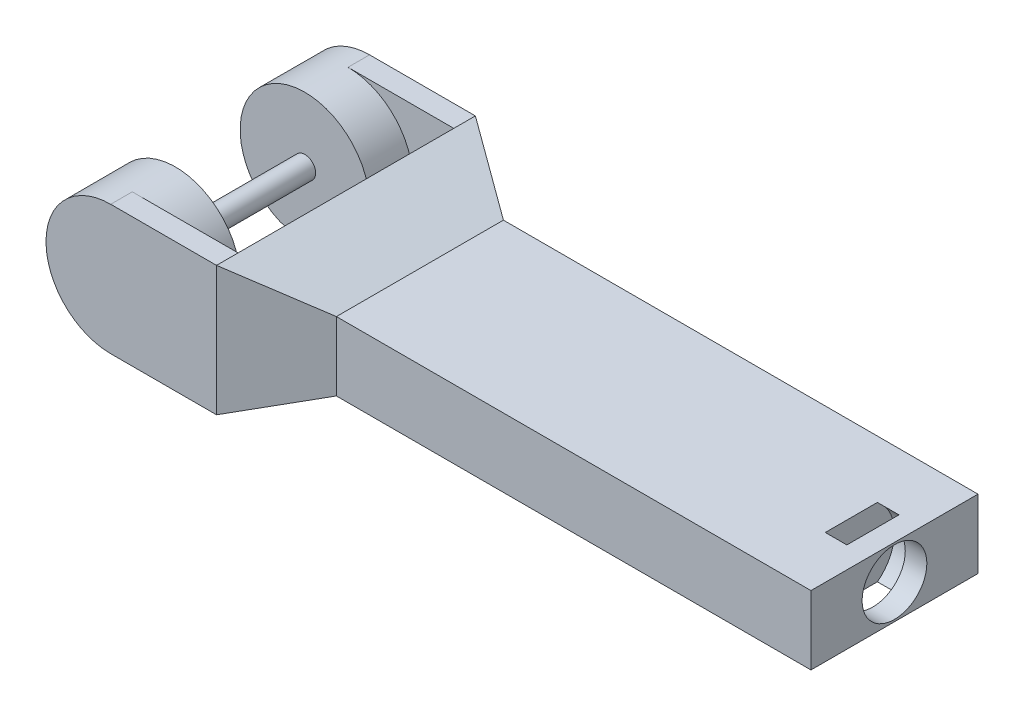
ISO-10303-21;
HEADER;
FILE_DESCRIPTION(('STEP AP214'),'2;1');
FILE_NAME('part.step','',(''),(''),'','','');
FILE_SCHEMA(('AUTOMOTIVE_DESIGN { 1 0 10303 214 1 1 1 1 }'));
ENDSEC;
DATA;
#1=APPLICATION_CONTEXT('core data for automotive mechanical design processes');
#2=APPLICATION_PROTOCOL_DEFINITION('international standard','automotive_design',2000,#1);
#3=PRODUCT_CONTEXT('',#1,'mechanical');
#4=PRODUCT('Part','Part','',(#3));
#5=PRODUCT_RELATED_PRODUCT_CATEGORY('part','',(#4));
#6=PRODUCT_DEFINITION_FORMATION('','',#4);
#7=PRODUCT_DEFINITION_CONTEXT('part definition',#1,'design');
#8=PRODUCT_DEFINITION('design','',#6,#7);
#9=PRODUCT_DEFINITION_SHAPE('','',#8);
#10=(LENGTH_UNIT() NAMED_UNIT(*) SI_UNIT(.MILLI.,.METRE.));
#11=(NAMED_UNIT(*) PLANE_ANGLE_UNIT() SI_UNIT($,.RADIAN.));
#12=(NAMED_UNIT(*) SI_UNIT($,.STERADIAN.) SOLID_ANGLE_UNIT());
#13=UNCERTAINTY_MEASURE_WITH_UNIT(LENGTH_MEASURE(1.E-05),#10,'distance_accuracy_value','');
#14=(GEOMETRIC_REPRESENTATION_CONTEXT(3) GLOBAL_UNCERTAINTY_ASSIGNED_CONTEXT((#13)) GLOBAL_UNIT_ASSIGNED_CONTEXT((#10,
#11,#12)) REPRESENTATION_CONTEXT('',''));
#15=CARTESIAN_POINT('',(0.,0.,0.));
#16=DIRECTION('',(0.,0.,1.));
#17=DIRECTION('',(1.,0.,0.));
#18=AXIS2_PLACEMENT_3D('',#15,#16,#17);
#19=CARTESIAN_POINT('',(303.334576319723,-15.9426631994788,38.7153095858183));
#20=DIRECTION('',(0.,1.,0.));
#21=DIRECTION('',(0.,0.,1.));
#22=AXIS2_PLACEMENT_3D('',#19,#20,#21);
#23=PLANE('',#22);
#24=DIRECTION('',(0.,0.,-1.));
#25=VECTOR('',#24,1.);
#26=CARTESIAN_POINT('',(83.3345763197232,-15.9426631994788,60.));
#27=LINE('',#26,#25);
#28=CARTESIAN_POINT('',(83.3345763197232,-15.9426631994788,38.7153095858183));
#29=VERTEX_POINT('',#28);
#30=CARTESIAN_POINT('',(83.3345763197232,-15.9426631994788,-38.7153095858182));
#31=VERTEX_POINT('',#30);
#32=EDGE_CURVE('E297',#29,#31,#27,.T.);
#33=ORIENTED_EDGE('',*,*,#32,.T.);
#34=DIRECTION('',(-1.,0.,0.));
#35=VECTOR('',#34,1.);
#36=CARTESIAN_POINT('',(303.334576319723,-15.9426631994788,-38.7153095858182));
#37=LINE('',#36,#35);
#38=CARTESIAN_POINT('',(303.334576319723,-15.9426631994788,-38.7153095858182));
#39=VERTEX_POINT('',#38);
#40=EDGE_CURVE('E353',#39,#31,#37,.T.);
#41=ORIENTED_EDGE('',*,*,#40,.F.);
#42=DIRECTION('',(0.,0.,-1.));
#43=VECTOR('',#42,1.);
#44=CARTESIAN_POINT('',(303.334576319723,-15.9426631994788,38.7153095858183));
#45=LINE('',#44,#43);
#46=CARTESIAN_POINT('',(303.334576319723,-15.9426631994788,38.7153095858183));
#47=VERTEX_POINT('',#46);
#48=EDGE_CURVE('E623',#47,#39,#45,.T.);
#49=ORIENTED_EDGE('',*,*,#48,.F.);
#50=DIRECTION('',(-1.,0.,0.));
#51=VECTOR('',#50,1.);
#52=CARTESIAN_POINT('',(303.334576319723,-15.9426631994788,38.7153095858183));
#53=LINE('',#52,#51);
#54=EDGE_CURVE('E630',#47,#29,#53,.T.);
#55=ORIENTED_EDGE('',*,*,#54,.T.);
#56=EDGE_LOOP('',(#33,#41,#49,#55));
#57=FACE_BOUND('',#56,.T.);
#58=DIRECTION('',(0.,0.,-1.));
#59=VECTOR('',#58,1.);
#60=CARTESIAN_POINT('',(283.334576319723,-15.9426631994788,38.7153095858183));
#61=LINE('',#60,#59);
#62=CARTESIAN_POINT('',(283.334576319723,-15.9426631994788,12.0760709714701));
#63=VERTEX_POINT('',#62);
#64=CARTESIAN_POINT('',(283.334576319723,-15.9426631994788,-12.0760709714701));
#65=VERTEX_POINT('',#64);
#66=EDGE_CURVE('E611',#63,#65,#61,.T.);
#67=ORIENTED_EDGE('',*,*,#66,.F.);
#68=DIRECTION('',(1.,0.,0.));
#69=VECTOR('',#68,1.);
#70=CARTESIAN_POINT('',(283.334576319723,-15.9426631994788,12.0760709714701));
#71=LINE('',#70,#69);
#72=CARTESIAN_POINT('',(293.334576319723,-15.9426631994788,12.0760709714701));
#73=VERTEX_POINT('',#72);
#74=EDGE_CURVE('E614',#63,#73,#71,.T.);
#75=ORIENTED_EDGE('',*,*,#74,.T.);
#76=DIRECTION('',(0.,0.,-1.));
#77=VECTOR('',#76,1.);
#78=CARTESIAN_POINT('',(293.334576319723,-15.9426631994788,38.7153095858183));
#79=LINE('',#78,#77);
#80=CARTESIAN_POINT('',(293.334576319723,-15.9426631994788,-12.0760709714701));
#81=VERTEX_POINT('',#80);
#82=EDGE_CURVE('E147',#73,#81,#79,.T.);
#83=ORIENTED_EDGE('',*,*,#82,.T.);
#84=DIRECTION('',(1.,0.,0.));
#85=VECTOR('',#84,1.);
#86=CARTESIAN_POINT('',(283.334576319723,-15.9426631994788,-12.0760709714701));
#87=LINE('',#86,#85);
#88=EDGE_CURVE('E155',#81,#65,#87,.F.);
#89=ORIENTED_EDGE('',*,*,#88,.T.);
#90=EDGE_LOOP('',(#67,#75,#83,#89));
#91=FACE_BOUND('',#90,.T.);
#92=ADVANCED_FACE('F33',(#57,#91),#23,.F.);
#93=CARTESIAN_POINT('',(303.334576319723,15.9426631994788,38.7153095858183));
#94=DIRECTION('',(0.,-1.,0.));
#95=DIRECTION('',(0.,0.,-1.));
#96=AXIS2_PLACEMENT_3D('',#93,#94,#95);
#97=PLANE('',#96);
#98=DIRECTION('',(0.,0.,-1.));
#99=VECTOR('',#98,1.);
#100=CARTESIAN_POINT('',(83.3345763197232,15.9426631994788,60.));
#101=LINE('',#100,#99);
#102=CARTESIAN_POINT('',(83.3345763197232,15.9426631994788,38.7153095858183));
#103=VERTEX_POINT('',#102);
#104=CARTESIAN_POINT('',(83.3345763197232,15.9426631994788,-38.7153095858182));
#105=VERTEX_POINT('',#104);
#106=EDGE_CURVE('E320',#103,#105,#101,.T.);
#107=ORIENTED_EDGE('',*,*,#106,.F.);
#108=DIRECTION('',(-1.,0.,0.));
#109=VECTOR('',#108,1.);
#110=CARTESIAN_POINT('',(303.334576319723,15.9426631994788,38.7153095858183));
#111=LINE('',#110,#109);
#112=CARTESIAN_POINT('',(303.334576319723,15.9426631994788,38.7153095858183));
#113=VERTEX_POINT('',#112);
#114=EDGE_CURVE('E358',#113,#103,#111,.T.);
#115=ORIENTED_EDGE('',*,*,#114,.F.);
#116=DIRECTION('',(0.,0.,1.));
#117=VECTOR('',#116,1.);
#118=CARTESIAN_POINT('',(303.334576319723,15.9426631994788,38.7153095858183));
#119=LINE('',#118,#117);
#120=CARTESIAN_POINT('',(303.334576319723,15.9426631994788,-38.7153095858182));
#121=VERTEX_POINT('',#120);
#122=EDGE_CURVE('E357',#121,#113,#119,.T.);
#123=ORIENTED_EDGE('',*,*,#122,.F.);
#124=DIRECTION('',(-1.,0.,0.));
#125=VECTOR('',#124,1.);
#126=CARTESIAN_POINT('',(303.334576319723,15.9426631994788,-38.7153095858182));
#127=LINE('',#126,#125);
#128=EDGE_CURVE('E350',#121,#105,#127,.T.);
#129=ORIENTED_EDGE('',*,*,#128,.T.);
#130=EDGE_LOOP('',(#107,#115,#123,#129));
#131=FACE_BOUND('',#130,.T.);
#132=DIRECTION('',(0.,0.,1.));
#133=VECTOR('',#132,1.);
#134=CARTESIAN_POINT('',(283.334576319723,15.9426631994788,38.7153095858183));
#135=LINE('',#134,#133);
#136=CARTESIAN_POINT('',(283.334576319723,15.9426631994788,-12.0760709714701));
#137=VERTEX_POINT('',#136);
#138=CARTESIAN_POINT('',(283.334576319723,15.9426631994788,12.0760709714701));
#139=VERTEX_POINT('',#138);
#140=EDGE_CURVE('E11',#137,#139,#135,.T.);
#141=ORIENTED_EDGE('',*,*,#140,.F.);
#142=DIRECTION('',(1.,0.,0.));
#143=VECTOR('',#142,1.);
#144=CARTESIAN_POINT('',(283.334576319723,15.9426631994788,-12.0760709714701));
#145=LINE('',#144,#143);
#146=CARTESIAN_POINT('',(293.334576319723,15.9426631994788,-12.0760709714701));
#147=VERTEX_POINT('',#146);
#148=EDGE_CURVE('E41',#137,#147,#145,.T.);
#149=ORIENTED_EDGE('',*,*,#148,.T.);
#150=DIRECTION('',(0.,0.,1.));
#151=VECTOR('',#150,1.);
#152=CARTESIAN_POINT('',(293.334576319723,15.9426631994788,38.7153095858183));
#153=LINE('',#152,#151);
#154=CARTESIAN_POINT('',(293.334576319723,15.9426631994788,12.0760709714701));
#155=VERTEX_POINT('',#154);
#156=EDGE_CURVE('E142',#147,#155,#153,.T.);
#157=ORIENTED_EDGE('',*,*,#156,.T.);
#158=DIRECTION('',(1.,0.,0.));
#159=VECTOR('',#158,1.);
#160=CARTESIAN_POINT('',(283.334576319723,15.9426631994788,12.0760709714701));
#161=LINE('',#160,#159);
#162=EDGE_CURVE('E160',#155,#139,#161,.F.);
#163=ORIENTED_EDGE('',*,*,#162,.T.);
#164=EDGE_LOOP('',(#141,#149,#157,#163));
#165=FACE_BOUND('',#164,.T.);
#166=ADVANCED_FACE('F159',(#131,#165),#97,.F.);
#167=CARTESIAN_POINT('',(0.,0.,-60.));
#168=DIRECTION('',(0.,0.,-1.));
#169=DIRECTION('',(1.,0.,0.));
#170=AXIS2_PLACEMENT_3D('',#167,#168,#169);
#171=PLANE('',#170);
#172=DIRECTION('',(-1.,0.,0.));
#173=VECTOR('',#172,1.);
#174=CARTESIAN_POINT('',(0.,30.,-60.));
#175=LINE('',#174,#173);
#176=CARTESIAN_POINT('',(49.0468505242722,30.,-60.));
#177=VERTEX_POINT('',#176);
#178=CARTESIAN_POINT('',(0.,30.,-60.));
#179=VERTEX_POINT('',#178);
#180=EDGE_CURVE('E330',#177,#179,#175,.T.);
#181=ORIENTED_EDGE('',*,*,#180,.F.);
#182=DIRECTION('',(0.,-1.,0.));
#183=VECTOR('',#182,1.);
#184=CARTESIAN_POINT('',(49.0468505242722,219.533419258263,-60.));
#185=LINE('',#184,#183);
#186=CARTESIAN_POINT('',(49.0468505242722,-30.,-60.));
#187=VERTEX_POINT('',#186);
#188=EDGE_CURVE('E309',#177,#187,#185,.T.);
#189=ORIENTED_EDGE('',*,*,#188,.T.);
#190=DIRECTION('',(1.,0.,0.));
#191=VECTOR('',#190,1.);
#192=CARTESIAN_POINT('',(0.,-30.,-60.));
#193=LINE('',#192,#191);
#194=CARTESIAN_POINT('',(0.,-30.,-60.));
#195=VERTEX_POINT('',#194);
#196=EDGE_CURVE('E243',#195,#187,#193,.T.);
#197=ORIENTED_EDGE('',*,*,#196,.F.);
#198=CARTESIAN_POINT('',(0.,0.,-60.));
#199=DIRECTION('',(0.,0.,1.));
#200=DIRECTION('',(1.,0.,0.));
#201=AXIS2_PLACEMENT_3D('',#198,#199,#200);
#202=CIRCLE('',#201,30.);
#203=EDGE_CURVE('E249',#179,#195,#202,.T.);
#204=ORIENTED_EDGE('',*,*,#203,.F.);
#205=EDGE_LOOP('',(#181,#189,#197,#204));
#206=FACE_BOUND('',#205,.T.);
#207=ADVANCED_FACE('F364',(#206),#171,.T.);
#208=CARTESIAN_POINT('',(49.0468505242722,30.,60.));
#209=DIRECTION('',(-0.379338709094435,-0.925257879611175,0.));
#210=DIRECTION('',(0.925257879611175,-0.379338709094435,0.));
#211=AXIS2_PLACEMENT_3D('',#208,#209,#210);
#212=PLANE('',#211);
#213=DIRECTION('',(0.,0.,-1.));
#214=VECTOR('',#213,1.);
#215=CARTESIAN_POINT('',(49.0468505242722,30.,60.));
#216=LINE('',#215,#214);
#217=CARTESIAN_POINT('',(49.0468505242722,30.,60.));
#218=VERTEX_POINT('',#217);
#219=CARTESIAN_POINT('',(49.0468505242722,30.,50.));
#220=VERTEX_POINT('',#219);
#221=EDGE_CURVE('E176',#218,#220,#216,.T.);
#222=ORIENTED_EDGE('',*,*,#221,.F.);
#223=DIRECTION('',(0.802330361490163,-0.328940688106164,-0.49806025211746));
#224=VECTOR('',#223,1.);
#225=CARTESIAN_POINT('',(49.0468505242722,30.,60.));
#226=LINE('',#225,#224);
#227=EDGE_CURVE('E300',#218,#103,#226,.T.);
#228=ORIENTED_EDGE('',*,*,#227,.T.);
#229=ORIENTED_EDGE('',*,*,#106,.T.);
#230=DIRECTION('',(0.802330361490163,-0.328940688106164,0.49806025211746));
#231=VECTOR('',#230,1.);
#232=CARTESIAN_POINT('',(96.9999139793062,10.3401261540184,-30.2323182312831));
#233=LINE('',#232,#231);
#234=EDGE_CURVE('E317',#177,#105,#233,.T.);
#235=ORIENTED_EDGE('',*,*,#234,.F.);
#236=DIRECTION('',(0.,0.,1.));
#237=VECTOR('',#236,1.);
#238=CARTESIAN_POINT('',(49.0468505242722,30.,-60.));
#239=LINE('',#238,#237);
#240=CARTESIAN_POINT('',(49.0468505242722,30.,-50.));
#241=VERTEX_POINT('',#240);
#242=EDGE_CURVE('E236',#177,#241,#239,.T.);
#243=ORIENTED_EDGE('',*,*,#242,.T.);
#244=DIRECTION('',(0.,0.,-1.));
#245=VECTOR('',#244,1.);
#246=CARTESIAN_POINT('',(49.0468505242722,30.,60.));
#247=LINE('',#246,#245);
#248=EDGE_CURVE('E231',#220,#241,#247,.T.);
#249=ORIENTED_EDGE('',*,*,#248,.F.);
#250=EDGE_LOOP('',(#222,#228,#229,#235,#243,#249));
#251=FACE_BOUND('',#250,.T.);
#252=ADVANCED_FACE('F360',(#251),#212,.F.);
#253=CARTESIAN_POINT('',(49.0468505242722,-30.,60.));
#254=DIRECTION('',(-0.379338709094435,0.925257879611175,0.));
#255=DIRECTION('',(-0.925257879611175,-0.379338709094435,0.));
#256=AXIS2_PLACEMENT_3D('',#253,#254,#255);
#257=PLANE('',#256);
#258=ORIENTED_EDGE('',*,*,#32,.F.);
#259=DIRECTION('',(-0.802330361490163,-0.328940688106164,0.49806025211746));
#260=VECTOR('',#259,1.);
#261=CARTESIAN_POINT('',(49.0468505242722,-30.,60.));
#262=LINE('',#261,#260);
#263=CARTESIAN_POINT('',(49.0468505242722,-30.,60.));
#264=VERTEX_POINT('',#263);
#265=EDGE_CURVE('E294',#29,#264,#262,.T.);
#266=ORIENTED_EDGE('',*,*,#265,.T.);
#267=DIRECTION('',(0.,0.,-1.));
#268=VECTOR('',#267,1.);
#269=CARTESIAN_POINT('',(49.0468505242722,-30.,60.));
#270=LINE('',#269,#268);
#271=CARTESIAN_POINT('',(49.0468505242722,-30.,50.));
#272=VERTEX_POINT('',#271);
#273=EDGE_CURVE('E172',#264,#272,#270,.T.);
#274=ORIENTED_EDGE('',*,*,#273,.T.);
#275=DIRECTION('',(0.,0.,-1.));
#276=VECTOR('',#275,1.);
#277=CARTESIAN_POINT('',(49.0468505242722,-30.,60.));
#278=LINE('',#277,#276);
#279=CARTESIAN_POINT('',(49.0468505242722,-30.,-50.));
#280=VERTEX_POINT('',#279);
#281=EDGE_CURVE('E291',#272,#280,#278,.T.);
#282=ORIENTED_EDGE('',*,*,#281,.T.);
#283=DIRECTION('',(0.,0.,1.));
#284=VECTOR('',#283,1.);
#285=CARTESIAN_POINT('',(49.0468505242722,-30.,-60.));
#286=LINE('',#285,#284);
#287=EDGE_CURVE('E242',#187,#280,#286,.T.);
#288=ORIENTED_EDGE('',*,*,#287,.F.);
#289=DIRECTION('',(-0.802330361490163,-0.328940688106164,-0.49806025211746));
#290=VECTOR('',#289,1.);
#291=CARTESIAN_POINT('',(96.9999139793062,-10.3401261540184,-30.2323182312831));
#292=LINE('',#291,#290);
#293=EDGE_CURVE('E311',#31,#187,#292,.T.);
#294=ORIENTED_EDGE('',*,*,#293,.F.);
#295=EDGE_LOOP('',(#258,#266,#274,#282,#288,#294));
#296=FACE_BOUND('',#295,.T.);
#297=ADVANCED_FACE('F288',(#296),#257,.F.);
#298=CARTESIAN_POINT('',(0.,0.,30.));
#299=DIRECTION('',(0.,0.,-1.));
#300=DIRECTION('',(-1.,0.,0.));
#301=AXIS2_PLACEMENT_3D('',#298,#299,#300);
#302=CYLINDRICAL_SURFACE('',#301,5.);
#303=CARTESIAN_POINT('',(0.,0.,30.));
#304=DIRECTION('',(0.,0.,1.));
#305=DIRECTION('',(1.,0.,0.));
#306=AXIS2_PLACEMENT_3D('',#303,#304,#305);
#307=CIRCLE('',#306,5.);
#308=CARTESIAN_POINT('',(5.,0.,30.));
#309=VERTEX_POINT('',#308);
#310=EDGE_CURVE('E169',#309,#309,#307,.T.);
#311=ORIENTED_EDGE('',*,*,#310,.F.);
#312=EDGE_LOOP('',(#311));
#313=FACE_BOUND('',#312,.T.);
#314=CARTESIAN_POINT('',(0.,0.,-30.));
#315=DIRECTION('',(0.,0.,-1.));
#316=DIRECTION('',(-1.,0.,0.));
#317=AXIS2_PLACEMENT_3D('',#314,#315,#316);
#318=CIRCLE('',#317,5.);
#319=CARTESIAN_POINT('',(-5.,0.,-30.));
#320=VERTEX_POINT('',#319);
#321=EDGE_CURVE('E194',#320,#320,#318,.T.);
#322=ORIENTED_EDGE('',*,*,#321,.F.);
#323=EDGE_LOOP('',(#322));
#324=FACE_BOUND('',#323,.T.);
#325=ADVANCED_FACE('F35',(#313,#324),#302,.T.);
#326=CARTESIAN_POINT('',(0.,0.,30.));
#327=DIRECTION('',(0.,0.,1.));
#328=DIRECTION('',(1.,0.,0.));
#329=AXIS2_PLACEMENT_3D('',#326,#327,#328);
#330=PLANE('',#329);
#331=CARTESIAN_POINT('',(0.,0.,30.));
#332=DIRECTION('',(0.,0.,1.));
#333=DIRECTION('',(1.,0.,0.));
#334=AXIS2_PLACEMENT_3D('',#331,#332,#333);
#335=CIRCLE('',#334,30.);
#336=CARTESIAN_POINT('',(30.,0.,30.));
#337=VERTEX_POINT('',#336);
#338=EDGE_CURVE('E197',#337,#337,#335,.T.);
#339=ORIENTED_EDGE('',*,*,#338,.F.);
#340=EDGE_LOOP('',(#339));
#341=FACE_BOUND('',#340,.T.);
#342=ORIENTED_EDGE('',*,*,#310,.T.);
#343=EDGE_LOOP('',(#342));
#344=FACE_BOUND('',#343,.T.);
#345=ADVANCED_FACE('F427',(#341,#344),#330,.F.);
#346=CARTESIAN_POINT('',(0.,0.,50.));
#347=DIRECTION('',(0.,0.,-1.));
#348=DIRECTION('',(-1.,0.,0.));
#349=AXIS2_PLACEMENT_3D('',#346,#347,#348);
#350=CYLINDRICAL_SURFACE('',#349,30.);
#351=CARTESIAN_POINT('',(0.,0.,50.));
#352=DIRECTION('',(0.,0.,1.));
#353=DIRECTION('',(1.,0.,0.));
#354=AXIS2_PLACEMENT_3D('',#351,#352,#353);
#355=CIRCLE('',#354,30.);
#356=CARTESIAN_POINT('',(0.,-30.,50.));
#357=VERTEX_POINT('',#356);
#358=CARTESIAN_POINT('',(0.,30.,50.));
#359=VERTEX_POINT('',#358);
#360=EDGE_CURVE('E200',#357,#359,#355,.T.);
#361=ORIENTED_EDGE('',*,*,#360,.F.);
#362=DIRECTION('',(0.,0.,-1.));
#363=VECTOR('',#362,1.);
#364=CARTESIAN_POINT('',(0.,-30.,60.));
#365=LINE('',#364,#363);
#366=CARTESIAN_POINT('',(0.,-30.,60.));
#367=VERTEX_POINT('',#366);
#368=EDGE_CURVE('E175',#367,#357,#365,.T.);
#369=ORIENTED_EDGE('',*,*,#368,.F.);
#370=CARTESIAN_POINT('',(0.,0.,60.));
#371=DIRECTION('',(0.,0.,1.));
#372=DIRECTION('',(1.,0.,0.));
#373=AXIS2_PLACEMENT_3D('',#370,#371,#372);
#374=CIRCLE('',#373,30.);
#375=CARTESIAN_POINT('',(0.,30.,60.));
#376=VERTEX_POINT('',#375);
#377=EDGE_CURVE('E208',#376,#367,#374,.T.);
#378=ORIENTED_EDGE('',*,*,#377,.F.);
#379=DIRECTION('',(0.,0.,-1.));
#380=VECTOR('',#379,1.);
#381=CARTESIAN_POINT('',(0.,30.,60.));
#382=LINE('',#381,#380);
#383=EDGE_CURVE('E211',#376,#359,#382,.T.);
#384=ORIENTED_EDGE('',*,*,#383,.T.);
#385=EDGE_LOOP('',(#361,#369,#378,#384));
#386=FACE_BOUND('',#385,.T.);
#387=ORIENTED_EDGE('',*,*,#338,.T.);
#388=EDGE_LOOP('',(#387));
#389=FACE_BOUND('',#388,.T.);
#390=ADVANCED_FACE('F279',(#386,#389),#350,.T.);
#391=CARTESIAN_POINT('',(0.,0.,-30.));
#392=DIRECTION('',(0.,0.,-1.));
#393=DIRECTION('',(1.,0.,0.));
#394=AXIS2_PLACEMENT_3D('',#391,#392,#393);
#395=PLANE('',#394);
#396=CARTESIAN_POINT('',(0.,0.,-30.));
#397=DIRECTION('',(0.,0.,1.));
#398=DIRECTION('',(1.,0.,0.));
#399=AXIS2_PLACEMENT_3D('',#396,#397,#398);
#400=CIRCLE('',#399,30.);
#401=CARTESIAN_POINT('',(30.,0.,-30.));
#402=VERTEX_POINT('',#401);
#403=EDGE_CURVE('E190',#402,#402,#400,.T.);
#404=ORIENTED_EDGE('',*,*,#403,.T.);
#405=EDGE_LOOP('',(#404));
#406=FACE_BOUND('',#405,.T.);
#407=ORIENTED_EDGE('',*,*,#321,.T.);
#408=EDGE_LOOP('',(#407));
#409=FACE_BOUND('',#408,.T.);
#410=ADVANCED_FACE('F382',(#406,#409),#395,.F.);
#411=CARTESIAN_POINT('',(0.,0.,-50.));
#412=DIRECTION('',(0.,0.,1.));
#413=DIRECTION('',(1.,0.,0.));
#414=AXIS2_PLACEMENT_3D('',#411,#412,#413);
#415=CYLINDRICAL_SURFACE('',#414,30.);
#416=CARTESIAN_POINT('',(0.,0.,-50.));
#417=DIRECTION('',(0.,0.,1.));
#418=DIRECTION('',(1.,0.,0.));
#419=AXIS2_PLACEMENT_3D('',#416,#417,#418);
#420=CIRCLE('',#419,30.);
#421=CARTESIAN_POINT('',(0.,-30.,-50.));
#422=VERTEX_POINT('',#421);
#423=CARTESIAN_POINT('',(0.,30.,-50.));
#424=VERTEX_POINT('',#423);
#425=EDGE_CURVE('E193',#422,#424,#420,.T.);
#426=ORIENTED_EDGE('',*,*,#425,.T.);
#427=DIRECTION('',(0.,0.,1.));
#428=VECTOR('',#427,1.);
#429=CARTESIAN_POINT('',(0.,30.,-60.));
#430=LINE('',#429,#428);
#431=EDGE_CURVE('E217',#179,#424,#430,.T.);
#432=ORIENTED_EDGE('',*,*,#431,.F.);
#433=ORIENTED_EDGE('',*,*,#203,.T.);
#434=DIRECTION('',(0.,0.,1.));
#435=VECTOR('',#434,1.);
#436=CARTESIAN_POINT('',(0.,-30.,-60.));
#437=LINE('',#436,#435);
#438=EDGE_CURVE('E239',#195,#422,#437,.T.);
#439=ORIENTED_EDGE('',*,*,#438,.T.);
#440=EDGE_LOOP('',(#426,#432,#433,#439));
#441=FACE_BOUND('',#440,.T.);
#442=ORIENTED_EDGE('',*,*,#403,.F.);
#443=EDGE_LOOP('',(#442));
#444=FACE_BOUND('',#443,.T.);
#445=ADVANCED_FACE('F366',(#441,#444),#415,.T.);
#446=CARTESIAN_POINT('',(0.,0.,50.));
#447=DIRECTION('',(0.,0.,1.));
#448=DIRECTION('',(1.,0.,0.));
#449=AXIS2_PLACEMENT_3D('',#446,#447,#448);
#450=PLANE('',#449);
#451=DIRECTION('',(1.,0.,0.));
#452=VECTOR('',#451,1.);
#453=CARTESIAN_POINT('',(0.,-30.,50.));
#454=LINE('',#453,#452);
#455=EDGE_CURVE('E182',#357,#272,#454,.T.);
#456=ORIENTED_EDGE('',*,*,#455,.F.);
#457=ORIENTED_EDGE('',*,*,#360,.T.);
#458=DIRECTION('',(-1.,0.,0.));
#459=VECTOR('',#458,1.);
#460=CARTESIAN_POINT('',(0.,30.,50.));
#461=LINE('',#460,#459);
#462=EDGE_CURVE('E181',#220,#359,#461,.T.);
#463=ORIENTED_EDGE('',*,*,#462,.F.);
#464=DIRECTION('',(0.,1.,0.));
#465=VECTOR('',#464,1.);
#466=CARTESIAN_POINT('',(49.0468505242722,30.,50.));
#467=LINE('',#466,#465);
#468=EDGE_CURVE('E177',#272,#220,#467,.T.);
#469=ORIENTED_EDGE('',*,*,#468,.F.);
#470=EDGE_LOOP('',(#456,#457,#463,#469));
#471=FACE_BOUND('',#470,.T.);
#472=ADVANCED_FACE('F374',(#471),#450,.F.);
#473=CARTESIAN_POINT('',(0.,-30.,60.));
#474=DIRECTION('',(0.,1.,0.));
#475=DIRECTION('',(0.,0.,1.));
#476=AXIS2_PLACEMENT_3D('',#473,#474,#475);
#477=PLANE('',#476);
#478=ORIENTED_EDGE('',*,*,#455,.T.);
#479=ORIENTED_EDGE('',*,*,#273,.F.);
#480=DIRECTION('',(1.,0.,0.));
#481=VECTOR('',#480,1.);
#482=CARTESIAN_POINT('',(0.,-30.,60.));
#483=LINE('',#482,#481);
#484=EDGE_CURVE('E265',#367,#264,#483,.T.);
#485=ORIENTED_EDGE('',*,*,#484,.F.);
#486=ORIENTED_EDGE('',*,*,#368,.T.);
#487=EDGE_LOOP('',(#478,#479,#485,#486));
#488=FACE_BOUND('',#487,.T.);
#489=ADVANCED_FACE('F283',(#488),#477,.F.);
#490=CARTESIAN_POINT('',(0.,30.,60.));
#491=DIRECTION('',(0.,-1.,0.));
#492=DIRECTION('',(0.,0.,-1.));
#493=AXIS2_PLACEMENT_3D('',#490,#491,#492);
#494=PLANE('',#493);
#495=ORIENTED_EDGE('',*,*,#462,.T.);
#496=ORIENTED_EDGE('',*,*,#383,.F.);
#497=DIRECTION('',(-1.,0.,0.));
#498=VECTOR('',#497,1.);
#499=CARTESIAN_POINT('',(0.,30.,60.));
#500=LINE('',#499,#498);
#501=EDGE_CURVE('E188',#218,#376,#500,.T.);
#502=ORIENTED_EDGE('',*,*,#501,.F.);
#503=ORIENTED_EDGE('',*,*,#221,.T.);
#504=EDGE_LOOP('',(#495,#496,#502,#503));
#505=FACE_BOUND('',#504,.T.);
#506=ADVANCED_FACE('F277',(#505),#494,.F.);
#507=CARTESIAN_POINT('',(0.,0.,60.));
#508=DIRECTION('',(0.,0.,1.));
#509=DIRECTION('',(1.,0.,0.));
#510=AXIS2_PLACEMENT_3D('',#507,#508,#509);
#511=PLANE('',#510);
#512=DIRECTION('',(0.,-1.,0.));
#513=VECTOR('',#512,1.);
#514=CARTESIAN_POINT('',(49.0468505242722,0.,60.));
#515=LINE('',#514,#513);
#516=EDGE_CURVE('E161',#218,#264,#515,.T.);
#517=ORIENTED_EDGE('',*,*,#516,.F.);
#518=ORIENTED_EDGE('',*,*,#501,.T.);
#519=ORIENTED_EDGE('',*,*,#377,.T.);
#520=ORIENTED_EDGE('',*,*,#484,.T.);
#521=EDGE_LOOP('',(#517,#518,#519,#520));
#522=FACE_BOUND('',#521,.T.);
#523=ADVANCED_FACE('F271',(#522),#511,.T.);
#524=CARTESIAN_POINT('',(0.,30.,-60.));
#525=DIRECTION('',(0.,1.,0.));
#526=DIRECTION('',(0.,0.,1.));
#527=AXIS2_PLACEMENT_3D('',#524,#525,#526);
#528=PLANE('',#527);
#529=DIRECTION('',(-1.,0.,0.));
#530=VECTOR('',#529,1.);
#531=CARTESIAN_POINT('',(0.,30.,-50.));
#532=LINE('',#531,#530);
#533=EDGE_CURVE('E228',#241,#424,#532,.T.);
#534=ORIENTED_EDGE('',*,*,#533,.F.);
#535=ORIENTED_EDGE('',*,*,#242,.F.);
#536=ORIENTED_EDGE('',*,*,#180,.T.);
#537=ORIENTED_EDGE('',*,*,#431,.T.);
#538=EDGE_LOOP('',(#534,#535,#536,#537));
#539=FACE_BOUND('',#538,.T.);
#540=ADVANCED_FACE('F363',(#539),#528,.T.);
#541=CARTESIAN_POINT('',(0.,-30.,-60.));
#542=DIRECTION('',(0.,-1.,0.));
#543=DIRECTION('',(0.,0.,-1.));
#544=AXIS2_PLACEMENT_3D('',#541,#542,#543);
#545=PLANE('',#544);
#546=DIRECTION('',(1.,0.,0.));
#547=VECTOR('',#546,1.);
#548=CARTESIAN_POINT('',(0.,-30.,-50.));
#549=LINE('',#548,#547);
#550=EDGE_CURVE('E246',#422,#280,#549,.T.);
#551=ORIENTED_EDGE('',*,*,#550,.F.);
#552=ORIENTED_EDGE('',*,*,#438,.F.);
#553=ORIENTED_EDGE('',*,*,#196,.T.);
#554=ORIENTED_EDGE('',*,*,#287,.T.);
#555=EDGE_LOOP('',(#551,#552,#553,#554));
#556=FACE_BOUND('',#555,.T.);
#557=ADVANCED_FACE('F339',(#556),#545,.T.);
#558=CARTESIAN_POINT('',(0.,0.,-50.));
#559=DIRECTION('',(0.,0.,-1.));
#560=DIRECTION('',(1.,0.,0.));
#561=AXIS2_PLACEMENT_3D('',#558,#559,#560);
#562=PLANE('',#561);
#563=ORIENTED_EDGE('',*,*,#425,.F.);
#564=ORIENTED_EDGE('',*,*,#550,.T.);
#565=DIRECTION('',(0.,1.,0.));
#566=VECTOR('',#565,1.);
#567=CARTESIAN_POINT('',(49.0468505242722,30.,-50.));
#568=LINE('',#567,#566);
#569=EDGE_CURVE('E230',#280,#241,#568,.T.);
#570=ORIENTED_EDGE('',*,*,#569,.T.);
#571=ORIENTED_EDGE('',*,*,#533,.T.);
#572=EDGE_LOOP('',(#563,#564,#570,#571));
#573=FACE_BOUND('',#572,.T.);
#574=ADVANCED_FACE('F369',(#573),#562,.F.);
#575=CARTESIAN_POINT('',(49.0468505242722,-30.,60.));
#576=DIRECTION('',(1.,0.,0.));
#577=DIRECTION('',(0.,0.,-1.));
#578=AXIS2_PLACEMENT_3D('',#575,#576,#577);
#579=PLANE('',#578);
#580=ORIENTED_EDGE('',*,*,#281,.F.);
#581=ORIENTED_EDGE('',*,*,#468,.T.);
#582=ORIENTED_EDGE('',*,*,#248,.T.);
#583=ORIENTED_EDGE('',*,*,#569,.F.);
#584=EDGE_LOOP('',(#580,#581,#582,#583));
#585=FACE_BOUND('',#584,.T.);
#586=ADVANCED_FACE('F371',(#585),#579,.F.);
#587=CARTESIAN_POINT('',(49.0468505242722,219.533419258263,-60.));
#588=DIRECTION('',(0.527410329444046,0.,-0.849610701672079));
#589=DIRECTION('',(-0.849610701672079,0.,-0.527410329444046));
#590=AXIS2_PLACEMENT_3D('',#587,#588,#589);
#591=PLANE('',#590);
#592=ORIENTED_EDGE('',*,*,#188,.F.);
#593=ORIENTED_EDGE('',*,*,#234,.T.);
#594=DIRECTION('',(0.,-1.,0.));
#595=VECTOR('',#594,1.);
#596=CARTESIAN_POINT('',(83.3345763197232,15.9426631994788,-38.7153095858182));
#597=LINE('',#596,#595);
#598=EDGE_CURVE('E166',#105,#31,#597,.T.);
#599=ORIENTED_EDGE('',*,*,#598,.T.);
#600=ORIENTED_EDGE('',*,*,#293,.T.);
#601=EDGE_LOOP('',(#592,#593,#599,#600));
#602=FACE_BOUND('',#601,.T.);
#603=ADVANCED_FACE('F344',(#602),#591,.T.);
#604=CARTESIAN_POINT('',(49.0468505242722,257.033419258263,60.));
#605=DIRECTION('',(-0.527410329444046,0.,-0.849610701672079));
#606=DIRECTION('',(-0.849610701672079,0.,0.527410329444046));
#607=AXIS2_PLACEMENT_3D('',#604,#605,#606);
#608=PLANE('',#607);
#609=ORIENTED_EDGE('',*,*,#227,.F.);
#610=ORIENTED_EDGE('',*,*,#516,.T.);
#611=ORIENTED_EDGE('',*,*,#265,.F.);
#612=DIRECTION('',(0.,-1.,0.));
#613=VECTOR('',#612,1.);
#614=CARTESIAN_POINT('',(83.3345763197232,15.9426631994788,38.7153095858183));
#615=LINE('',#614,#613);
#616=EDGE_CURVE('E301',#103,#29,#615,.T.);
#617=ORIENTED_EDGE('',*,*,#616,.F.);
#618=EDGE_LOOP('',(#609,#610,#611,#617));
#619=FACE_BOUND('',#618,.T.);
#620=ADVANCED_FACE('F304',(#619),#608,.F.);
#621=CARTESIAN_POINT('',(303.334576319723,15.9426631994788,38.7153095858183));
#622=DIRECTION('',(0.,0.,-1.));
#623=DIRECTION('',(-1.,0.,0.));
#624=AXIS2_PLACEMENT_3D('',#621,#622,#623);
#625=PLANE('',#624);
#626=ORIENTED_EDGE('',*,*,#616,.T.);
#627=ORIENTED_EDGE('',*,*,#54,.F.);
#628=DIRECTION('',(0.,-1.,0.));
#629=VECTOR('',#628,1.);
#630=CARTESIAN_POINT('',(303.334576319723,15.9426631994788,38.7153095858183));
#631=LINE('',#630,#629);
#632=EDGE_CURVE('E620',#113,#47,#631,.T.);
#633=ORIENTED_EDGE('',*,*,#632,.F.);
#634=ORIENTED_EDGE('',*,*,#114,.T.);
#635=EDGE_LOOP('',(#626,#627,#633,#634));
#636=FACE_BOUND('',#635,.T.);
#637=ADVANCED_FACE('F396',(#636),#625,.F.);
#638=CARTESIAN_POINT('',(303.334576319723,15.9426631994788,-38.7153095858182));
#639=DIRECTION('',(0.,0.,1.));
#640=DIRECTION('',(1.,0.,0.));
#641=AXIS2_PLACEMENT_3D('',#638,#639,#640);
#642=PLANE('',#641);
#643=ORIENTED_EDGE('',*,*,#598,.F.);
#644=ORIENTED_EDGE('',*,*,#128,.F.);
#645=DIRECTION('',(0.,1.,0.));
#646=VECTOR('',#645,1.);
#647=CARTESIAN_POINT('',(303.334576319723,15.9426631994788,-38.7153095858182));
#648=LINE('',#647,#646);
#649=EDGE_CURVE('E625',#39,#121,#648,.T.);
#650=ORIENTED_EDGE('',*,*,#649,.F.);
#651=ORIENTED_EDGE('',*,*,#40,.T.);
#652=EDGE_LOOP('',(#643,#644,#650,#651));
#653=FACE_BOUND('',#652,.T.);
#654=ADVANCED_FACE('F348',(#653),#642,.F.);
#655=CARTESIAN_POINT('',(303.334576319723,0.,0.));
#656=DIRECTION('',(1.,0.,0.));
#657=DIRECTION('',(0.,0.,-1.));
#658=AXIS2_PLACEMENT_3D('',#655,#656,#657);
#659=PLANE('',#658);
#660=CARTESIAN_POINT('',(303.334576319723,0.,0.));
#661=DIRECTION('',(1.,0.,0.));
#662=DIRECTION('',(0.,0.,-1.));
#663=AXIS2_PLACEMENT_3D('',#660,#661,#662);
#664=CIRCLE('',#663,15.);
#665=CARTESIAN_POINT('',(303.334576319723,0.,-15.));
#666=VERTEX_POINT('',#665);
#667=EDGE_CURVE('E617',#666,#666,#664,.T.);
#668=ORIENTED_EDGE('',*,*,#667,.F.);
#669=EDGE_LOOP('',(#668));
#670=FACE_BOUND('',#669,.T.);
#671=ORIENTED_EDGE('',*,*,#632,.T.);
#672=ORIENTED_EDGE('',*,*,#48,.T.);
#673=ORIENTED_EDGE('',*,*,#649,.T.);
#674=ORIENTED_EDGE('',*,*,#122,.T.);
#675=EDGE_LOOP('',(#671,#672,#673,#674));
#676=FACE_BOUND('',#675,.T.);
#677=ADVANCED_FACE('F534',(#670,#676),#659,.T.);
#678=CARTESIAN_POINT('',(293.334576319723,0.,0.));
#679=DIRECTION('',(1.,0.,0.));
#680=DIRECTION('',(0.,0.,-1.));
#681=AXIS2_PLACEMENT_3D('',#678,#679,#680);
#682=CYLINDRICAL_SURFACE('',#681,15.);
#683=CARTESIAN_POINT('',(293.334576319723,0.,0.));
#684=DIRECTION('',(1.,0.,0.));
#685=DIRECTION('',(0.,0.,-1.));
#686=AXIS2_PLACEMENT_3D('',#683,#684,#685);
#687=CIRCLE('',#686,15.);
#688=CARTESIAN_POINT('',(293.334576319723,0.,-15.));
#689=VERTEX_POINT('',#688);
#690=EDGE_CURVE('E148',#689,#689,#687,.F.);
#691=ORIENTED_EDGE('',*,*,#690,.T.);
#692=EDGE_LOOP('',(#691));
#693=FACE_BOUND('',#692,.T.);
#694=ORIENTED_EDGE('',*,*,#667,.T.);
#695=EDGE_LOOP('',(#694));
#696=FACE_BOUND('',#695,.T.);
#697=ADVANCED_FACE('F542',(#693,#696),#682,.F.);
#698=CARTESIAN_POINT('',(283.334576319723,0.,0.));
#699=DIRECTION('',(1.,0.,0.));
#700=DIRECTION('',(0.,0.,-1.));
#701=AXIS2_PLACEMENT_3D('',#698,#699,#700);
#702=CYLINDRICAL_SURFACE('',#701,20.);
#703=CARTESIAN_POINT('',(283.334576319723,0.,0.));
#704=DIRECTION('',(1.,0.,0.));
#705=DIRECTION('',(0.,0.,-1.));
#706=AXIS2_PLACEMENT_3D('',#703,#704,#705);
#707=CIRCLE('',#706,20.);
#708=EDGE_CURVE('E604',#139,#63,#707,.T.);
#709=ORIENTED_EDGE('',*,*,#708,.F.);
#710=ORIENTED_EDGE('',*,*,#162,.F.);
#711=CARTESIAN_POINT('',(293.334576319723,0.,0.));
#712=DIRECTION('',(1.,0.,0.));
#713=DIRECTION('',(0.,0.,-1.));
#714=AXIS2_PLACEMENT_3D('',#711,#712,#713);
#715=CIRCLE('',#714,20.);
#716=EDGE_CURVE('E53',#155,#73,#715,.T.);
#717=ORIENTED_EDGE('',*,*,#716,.T.);
#718=ORIENTED_EDGE('',*,*,#74,.F.);
#719=EDGE_LOOP('',(#709,#710,#717,#718));
#720=FACE_BOUND('',#719,.T.);
#721=ADVANCED_FACE('F551',(#720),#702,.F.);
#722=EDGE_CURVE('E48',#81,#147,#715,.T.);
#723=ORIENTED_EDGE('',*,*,#722,.T.);
#724=ORIENTED_EDGE('',*,*,#148,.F.);
#725=EDGE_CURVE('E607',#65,#137,#707,.T.);
#726=ORIENTED_EDGE('',*,*,#725,.F.);
#727=ORIENTED_EDGE('',*,*,#88,.F.);
#728=EDGE_LOOP('',(#723,#724,#726,#727));
#729=FACE_BOUND('',#728,.T.);
#730=ADVANCED_FACE('F151',(#729),#702,.F.);
#731=CARTESIAN_POINT('',(283.334576319723,0.,0.));
#732=DIRECTION('',(1.,0.,0.));
#733=DIRECTION('',(0.,0.,-1.));
#734=AXIS2_PLACEMENT_3D('',#731,#732,#733);
#735=PLANE('',#734);
#736=ORIENTED_EDGE('',*,*,#66,.T.);
#737=ORIENTED_EDGE('',*,*,#725,.T.);
#738=ORIENTED_EDGE('',*,*,#140,.T.);
#739=ORIENTED_EDGE('',*,*,#708,.T.);
#740=EDGE_LOOP('',(#736,#737,#738,#739));
#741=FACE_BOUND('',#740,.T.);
#742=ADVANCED_FACE('F581',(#741),#735,.T.);
#743=CARTESIAN_POINT('',(293.334576319723,0.,0.));
#744=DIRECTION('',(1.,0.,0.));
#745=DIRECTION('',(0.,0.,-1.));
#746=AXIS2_PLACEMENT_3D('',#743,#744,#745);
#747=PLANE('',#746);
#748=ORIENTED_EDGE('',*,*,#690,.F.);
#749=EDGE_LOOP('',(#748));
#750=FACE_BOUND('',#749,.T.);
#751=ORIENTED_EDGE('',*,*,#716,.F.);
#752=ORIENTED_EDGE('',*,*,#156,.F.);
#753=ORIENTED_EDGE('',*,*,#722,.F.);
#754=ORIENTED_EDGE('',*,*,#82,.F.);
#755=EDGE_LOOP('',(#751,#752,#753,#754));
#756=FACE_BOUND('',#755,.T.);
#757=ADVANCED_FACE('F143',(#750,#756),#747,.F.);
#758=CLOSED_SHELL('',(#92,#166,#207,#252,#297,#325,#345,#390,#410,#445,#472,#489,#506,#523,#540,
#557,#574,#586,#603,#620,#637,#654,#677,#697,#721,#730,#742,#757));
#759=MANIFOLD_SOLID_BREP('B2',#758);
#760=ADVANCED_BREP_SHAPE_REPRESENTATION('',(#18,#759),#14);
#761=SHAPE_DEFINITION_REPRESENTATION(#9,#760);
ENDSEC;
END-ISO-10303-21;
